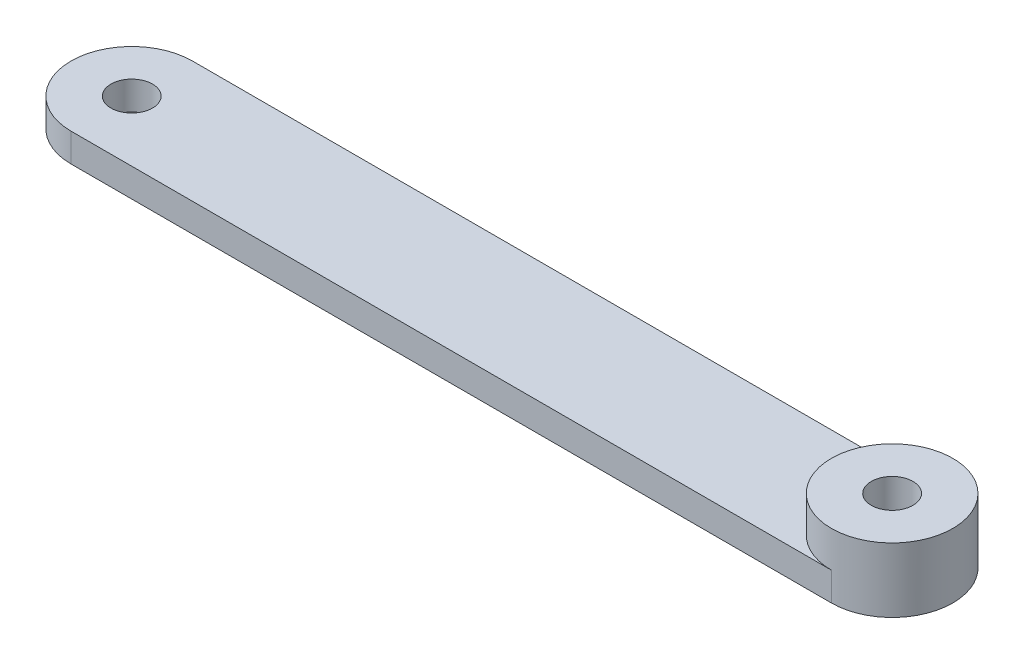
ISO-10303-21;
HEADER;
FILE_DESCRIPTION(('STEP AP214'),'2;1');
FILE_NAME('part.step','',(''),(''),'','','');
FILE_SCHEMA(('AUTOMOTIVE_DESIGN { 1 0 10303 214 1 1 1 1 }'));
ENDSEC;
DATA;
#1=APPLICATION_CONTEXT('core data for automotive mechanical design processes');
#2=APPLICATION_PROTOCOL_DEFINITION('international standard','automotive_design',2000,#1);
#3=PRODUCT_CONTEXT('',#1,'mechanical');
#4=PRODUCT('Part','Part','',(#3));
#5=PRODUCT_RELATED_PRODUCT_CATEGORY('part','',(#4));
#6=PRODUCT_DEFINITION_FORMATION('','',#4);
#7=PRODUCT_DEFINITION_CONTEXT('part definition',#1,'design');
#8=PRODUCT_DEFINITION('design','',#6,#7);
#9=PRODUCT_DEFINITION_SHAPE('','',#8);
#10=(LENGTH_UNIT() NAMED_UNIT(*) SI_UNIT(.MILLI.,.METRE.));
#11=(NAMED_UNIT(*) PLANE_ANGLE_UNIT() SI_UNIT($,.RADIAN.));
#12=(NAMED_UNIT(*) SI_UNIT($,.STERADIAN.) SOLID_ANGLE_UNIT());
#13=UNCERTAINTY_MEASURE_WITH_UNIT(LENGTH_MEASURE(1.E-05),#10,'distance_accuracy_value','');
#14=(GEOMETRIC_REPRESENTATION_CONTEXT(3) GLOBAL_UNCERTAINTY_ASSIGNED_CONTEXT((#13)) GLOBAL_UNIT_ASSIGNED_CONTEXT((#10,
#11,#12)) REPRESENTATION_CONTEXT('',''));
#15=CARTESIAN_POINT('',(0.,0.,0.));
#16=DIRECTION('',(0.,0.,1.));
#17=DIRECTION('',(1.,0.,0.));
#18=AXIS2_PLACEMENT_3D('',#15,#16,#17);
#19=CARTESIAN_POINT('',(-23.1719298245614,2.975,0.724122807017544));
#20=DIRECTION('',(0.,-1.,0.));
#21=DIRECTION('',(0.,0.,-1.));
#22=AXIS2_PLACEMENT_3D('',#19,#20,#21);
#23=CYLINDRICAL_SURFACE('',#22,6.35);
#24=CARTESIAN_POINT('',(-23.1719298245614,0.,0.724122807017544));
#25=DIRECTION('',(0.,1.,0.));
#26=DIRECTION('',(0.,0.,1.));
#27=AXIS2_PLACEMENT_3D('',#24,#25,#26);
#28=CIRCLE('',#27,6.35);
#29=CARTESIAN_POINT('',(-23.1719298245614,0.,-5.62587719298245));
#30=VERTEX_POINT('',#29);
#31=CARTESIAN_POINT('',(-23.1719298245614,0.,7.07412280701754));
#32=VERTEX_POINT('',#31);
#33=EDGE_CURVE('E127',#30,#32,#28,.T.);
#34=ORIENTED_EDGE('',*,*,#33,.T.);
#35=DIRECTION('',(0.,-1.,0.));
#36=VECTOR('',#35,1.);
#37=CARTESIAN_POINT('',(-23.1719298245614,2.975,7.07412280701754));
#38=LINE('',#37,#36);
#39=CARTESIAN_POINT('',(-23.1719298245614,2.975,7.07412280701754));
#40=VERTEX_POINT('',#39);
#41=EDGE_CURVE('E11',#40,#32,#38,.T.);
#42=ORIENTED_EDGE('',*,*,#41,.F.);
#43=CARTESIAN_POINT('',(-23.1719298245614,2.975,0.724122807017544));
#44=DIRECTION('',(0.,1.,0.));
#45=DIRECTION('',(0.,0.,1.));
#46=AXIS2_PLACEMENT_3D('',#43,#44,#45);
#47=CIRCLE('',#46,6.35);
#48=CARTESIAN_POINT('',(-23.1719298245614,2.975,-5.62587719298245));
#49=VERTEX_POINT('',#48);
#50=EDGE_CURVE('E122',#49,#40,#47,.T.);
#51=ORIENTED_EDGE('',*,*,#50,.F.);
#52=DIRECTION('',(0.,-1.,0.));
#53=VECTOR('',#52,1.);
#54=CARTESIAN_POINT('',(-23.1719298245614,2.975,-5.62587719298245));
#55=LINE('',#54,#53);
#56=EDGE_CURVE('E94',#49,#30,#55,.T.);
#57=ORIENTED_EDGE('',*,*,#56,.T.);
#58=EDGE_LOOP('',(#34,#42,#51,#57));
#59=FACE_BOUND('',#58,.T.);
#60=ADVANCED_FACE('F42',(#59),#23,.T.);
#61=CARTESIAN_POINT('',(-23.1719298245614,2.975,7.07412280701754));
#62=DIRECTION('',(0.,0.,-1.));
#63=DIRECTION('',(-1.,0.,0.));
#64=AXIS2_PLACEMENT_3D('',#61,#62,#63);
#65=PLANE('',#64);
#66=DIRECTION('',(1.,0.,0.));
#67=VECTOR('',#66,1.);
#68=CARTESIAN_POINT('',(-23.1719298245614,0.,7.07412280701754));
#69=LINE('',#68,#67);
#70=CARTESIAN_POINT('',(56.3300701754386,0.,7.07412280701754));
#71=VERTEX_POINT('',#70);
#72=EDGE_CURVE('E131',#32,#71,#69,.T.);
#73=ORIENTED_EDGE('',*,*,#72,.T.);
#74=DIRECTION('',(0.,-1.,0.));
#75=VECTOR('',#74,1.);
#76=CARTESIAN_POINT('',(56.3300701754386,2.975,7.07412280701754));
#77=LINE('',#76,#75);
#78=CARTESIAN_POINT('',(56.3300701754386,2.975,7.07412280701754));
#79=VERTEX_POINT('',#78);
#80=EDGE_CURVE('E52',#79,#71,#77,.T.);
#81=ORIENTED_EDGE('',*,*,#80,.F.);
#82=DIRECTION('',(1.,0.,0.));
#83=VECTOR('',#82,1.);
#84=CARTESIAN_POINT('',(-23.1719298245614,2.975,7.07412280701754));
#85=LINE('',#84,#83);
#86=EDGE_CURVE('E90',#40,#79,#85,.T.);
#87=ORIENTED_EDGE('',*,*,#86,.F.);
#88=ORIENTED_EDGE('',*,*,#41,.T.);
#89=EDGE_LOOP('',(#73,#81,#87,#88));
#90=FACE_BOUND('',#89,.T.);
#91=ADVANCED_FACE('F166',(#90),#65,.F.);
#92=CARTESIAN_POINT('',(56.3300701754386,2.975,0.724122807017545));
#93=DIRECTION('',(0.,-1.,0.));
#94=DIRECTION('',(0.,0.,-1.));
#95=AXIS2_PLACEMENT_3D('',#92,#93,#94);
#96=CYLINDRICAL_SURFACE('',#95,6.35);
#97=CARTESIAN_POINT('',(56.3300701754386,0.,0.724122807017545));
#98=DIRECTION('',(0.,1.,0.));
#99=DIRECTION('',(0.,0.,-1.));
#100=AXIS2_PLACEMENT_3D('',#97,#98,#99);
#101=CIRCLE('',#100,6.35);
#102=CARTESIAN_POINT('',(56.3300701754386,0.,-5.62587719298245));
#103=VERTEX_POINT('',#102);
#104=EDGE_CURVE('E80',#71,#103,#101,.T.);
#105=ORIENTED_EDGE('',*,*,#104,.T.);
#106=DIRECTION('',(0.,-1.,0.));
#107=VECTOR('',#106,1.);
#108=CARTESIAN_POINT('',(56.3300701754386,2.975,-5.62587719298245));
#109=LINE('',#108,#107);
#110=CARTESIAN_POINT('',(56.3300701754386,2.975,-5.62587719298245));
#111=VERTEX_POINT('',#110);
#112=EDGE_CURVE('E93',#111,#103,#109,.T.);
#113=ORIENTED_EDGE('',*,*,#112,.F.);
#114=CARTESIAN_POINT('',(56.3300701754386,2.975,0.724122807017545));
#115=DIRECTION('',(0.,1.,0.));
#116=DIRECTION('',(0.,0.,-1.));
#117=AXIS2_PLACEMENT_3D('',#114,#115,#116);
#118=CIRCLE('',#117,6.35);
#119=EDGE_CURVE('E101',#111,#79,#118,.T.);
#120=ORIENTED_EDGE('',*,*,#119,.T.);
#121=ORIENTED_EDGE('',*,*,#80,.T.);
#122=EDGE_LOOP('',(#105,#113,#120,#121));
#123=FACE_BOUND('',#122,.T.);
#124=CARTESIAN_POINT('',(56.3300701754386,6.75,0.724122807017545));
#125=DIRECTION('',(0.,1.,0.));
#126=DIRECTION('',(0.,0.,1.));
#127=AXIS2_PLACEMENT_3D('',#124,#125,#126);
#128=CIRCLE('',#127,6.35);
#129=CARTESIAN_POINT('',(56.3300701754386,6.75,7.07412280701755));
#130=VERTEX_POINT('',#129);
#131=EDGE_CURVE('E107',#130,#130,#128,.T.);
#132=ORIENTED_EDGE('',*,*,#131,.F.);
#133=EDGE_LOOP('',(#132));
#134=FACE_BOUND('',#133,.T.);
#135=ADVANCED_FACE('F99',(#123,#134),#96,.T.);
#136=CARTESIAN_POINT('',(-23.1719298245614,2.975,-5.62587719298245));
#137=DIRECTION('',(0.,0.,1.));
#138=DIRECTION('',(1.,0.,0.));
#139=AXIS2_PLACEMENT_3D('',#136,#137,#138);
#140=PLANE('',#139);
#141=DIRECTION('',(-1.,0.,0.));
#142=VECTOR('',#141,1.);
#143=CARTESIAN_POINT('',(-23.1719298245614,0.,-5.62587719298245));
#144=LINE('',#143,#142);
#145=EDGE_CURVE('E85',#103,#30,#144,.T.);
#146=ORIENTED_EDGE('',*,*,#145,.T.);
#147=ORIENTED_EDGE('',*,*,#56,.F.);
#148=DIRECTION('',(-1.,0.,0.));
#149=VECTOR('',#148,1.);
#150=CARTESIAN_POINT('',(-23.1719298245614,2.975,-5.62587719298245));
#151=LINE('',#150,#149);
#152=EDGE_CURVE('E61',#111,#49,#151,.T.);
#153=ORIENTED_EDGE('',*,*,#152,.F.);
#154=ORIENTED_EDGE('',*,*,#112,.T.);
#155=EDGE_LOOP('',(#146,#147,#153,#154));
#156=FACE_BOUND('',#155,.T.);
#157=ADVANCED_FACE('F92',(#156),#140,.F.);
#158=CARTESIAN_POINT('',(-23.1719298245614,2.975,0.724122807017544));
#159=DIRECTION('',(0.,1.,0.));
#160=DIRECTION('',(0.,0.,1.));
#161=AXIS2_PLACEMENT_3D('',#158,#159,#160);
#162=PLANE('',#161);
#163=ORIENTED_EDGE('',*,*,#119,.F.);
#164=ORIENTED_EDGE('',*,*,#152,.T.);
#165=ORIENTED_EDGE('',*,*,#50,.T.);
#166=ORIENTED_EDGE('',*,*,#86,.T.);
#167=EDGE_LOOP('',(#163,#164,#165,#166));
#168=FACE_BOUND('',#167,.T.);
#169=CARTESIAN_POINT('',(-23.1719298245614,2.975,0.724122807017545));
#170=DIRECTION('',(0.,1.,0.));
#171=DIRECTION('',(0.,0.,1.));
#172=AXIS2_PLACEMENT_3D('',#169,#170,#171);
#173=CIRCLE('',#172,2.175);
#174=CARTESIAN_POINT('',(-23.1719298245614,2.975,2.89912280701754));
#175=VERTEX_POINT('',#174);
#176=EDGE_CURVE('E113',#175,#175,#173,.T.);
#177=ORIENTED_EDGE('',*,*,#176,.F.);
#178=EDGE_LOOP('',(#177));
#179=FACE_BOUND('',#178,.T.);
#180=ADVANCED_FACE('F104',(#168,#179),#162,.T.);
#181=CARTESIAN_POINT('',(-23.1719298245614,0.,0.724122807017544));
#182=DIRECTION('',(0.,1.,0.));
#183=DIRECTION('',(0.,0.,1.));
#184=AXIS2_PLACEMENT_3D('',#181,#182,#183);
#185=PLANE('',#184);
#186=CARTESIAN_POINT('',(-23.1719298245614,0.,0.724122807017545));
#187=DIRECTION('',(0.,1.,0.));
#188=DIRECTION('',(0.,0.,1.));
#189=AXIS2_PLACEMENT_3D('',#186,#187,#188);
#190=CIRCLE('',#189,2.175);
#191=CARTESIAN_POINT('',(-23.1719298245614,0.,2.89912280701754));
#192=VERTEX_POINT('',#191);
#193=EDGE_CURVE('E45',#192,#192,#190,.T.);
#194=ORIENTED_EDGE('',*,*,#193,.T.);
#195=EDGE_LOOP('',(#194));
#196=FACE_BOUND('',#195,.T.);
#197=CARTESIAN_POINT('',(56.3300701754386,0.,0.724122807017545));
#198=DIRECTION('',(0.,1.,0.));
#199=DIRECTION('',(0.,0.,1.));
#200=AXIS2_PLACEMENT_3D('',#197,#198,#199);
#201=CIRCLE('',#200,2.17500000000001);
#202=CARTESIAN_POINT('',(56.3300701754386,0.,2.89912280701755));
#203=VERTEX_POINT('',#202);
#204=EDGE_CURVE('E121',#203,#203,#201,.T.);
#205=ORIENTED_EDGE('',*,*,#204,.T.);
#206=EDGE_LOOP('',(#205));
#207=FACE_BOUND('',#206,.T.);
#208=ORIENTED_EDGE('',*,*,#33,.F.);
#209=ORIENTED_EDGE('',*,*,#145,.F.);
#210=ORIENTED_EDGE('',*,*,#104,.F.);
#211=ORIENTED_EDGE('',*,*,#72,.F.);
#212=EDGE_LOOP('',(#208,#209,#210,#211));
#213=FACE_BOUND('',#212,.T.);
#214=ADVANCED_FACE('F149',(#196,#207,#213),#185,.F.);
#215=CARTESIAN_POINT('',(56.3300701754386,-9.725,0.724122807017545));
#216=DIRECTION('',(0.,1.,0.));
#217=DIRECTION('',(0.,0.,1.));
#218=AXIS2_PLACEMENT_3D('',#215,#216,#217);
#219=CYLINDRICAL_SURFACE('',#218,2.17500000000001);
#220=ORIENTED_EDGE('',*,*,#204,.F.);
#221=EDGE_LOOP('',(#220));
#222=FACE_BOUND('',#221,.T.);
#223=CARTESIAN_POINT('',(56.3300701754386,6.75,0.724122807017545));
#224=DIRECTION('',(0.,1.,0.));
#225=DIRECTION('',(0.,0.,1.));
#226=AXIS2_PLACEMENT_3D('',#223,#224,#225);
#227=CIRCLE('',#226,2.17500000000001);
#228=CARTESIAN_POINT('',(56.3300701754386,6.75,2.89912280701755));
#229=VERTEX_POINT('',#228);
#230=EDGE_CURVE('E108',#229,#229,#227,.T.);
#231=ORIENTED_EDGE('',*,*,#230,.T.);
#232=EDGE_LOOP('',(#231));
#233=FACE_BOUND('',#232,.T.);
#234=ADVANCED_FACE('F154',(#222,#233),#219,.F.);
#235=CARTESIAN_POINT('',(-23.1719298245614,-9.725,0.724122807017545));
#236=DIRECTION('',(0.,1.,0.));
#237=DIRECTION('',(0.,0.,1.));
#238=AXIS2_PLACEMENT_3D('',#235,#236,#237);
#239=CYLINDRICAL_SURFACE('',#238,2.175);
#240=ORIENTED_EDGE('',*,*,#176,.T.);
#241=EDGE_LOOP('',(#240));
#242=FACE_BOUND('',#241,.T.);
#243=ORIENTED_EDGE('',*,*,#193,.F.);
#244=EDGE_LOOP('',(#243));
#245=FACE_BOUND('',#244,.T.);
#246=ADVANCED_FACE('F151',(#242,#245),#239,.F.);
#247=CARTESIAN_POINT('',(56.3300701754386,6.75,0.724122807017545));
#248=DIRECTION('',(0.,1.,0.));
#249=DIRECTION('',(0.,0.,1.));
#250=AXIS2_PLACEMENT_3D('',#247,#248,#249);
#251=PLANE('',#250);
#252=ORIENTED_EDGE('',*,*,#131,.T.);
#253=EDGE_LOOP('',(#252));
#254=FACE_BOUND('',#253,.T.);
#255=ORIENTED_EDGE('',*,*,#230,.F.);
#256=EDGE_LOOP('',(#255));
#257=FACE_BOUND('',#256,.T.);
#258=ADVANCED_FACE('F153',(#254,#257),#251,.T.);
#259=CLOSED_SHELL('',(#60,#91,#135,#157,#180,#214,#234,#246,#258));
#260=MANIFOLD_SOLID_BREP('B2',#259);
#261=ADVANCED_BREP_SHAPE_REPRESENTATION('',(#18,#260),#14);
#262=SHAPE_DEFINITION_REPRESENTATION(#9,#261);
ENDSEC;
END-ISO-10303-21;
